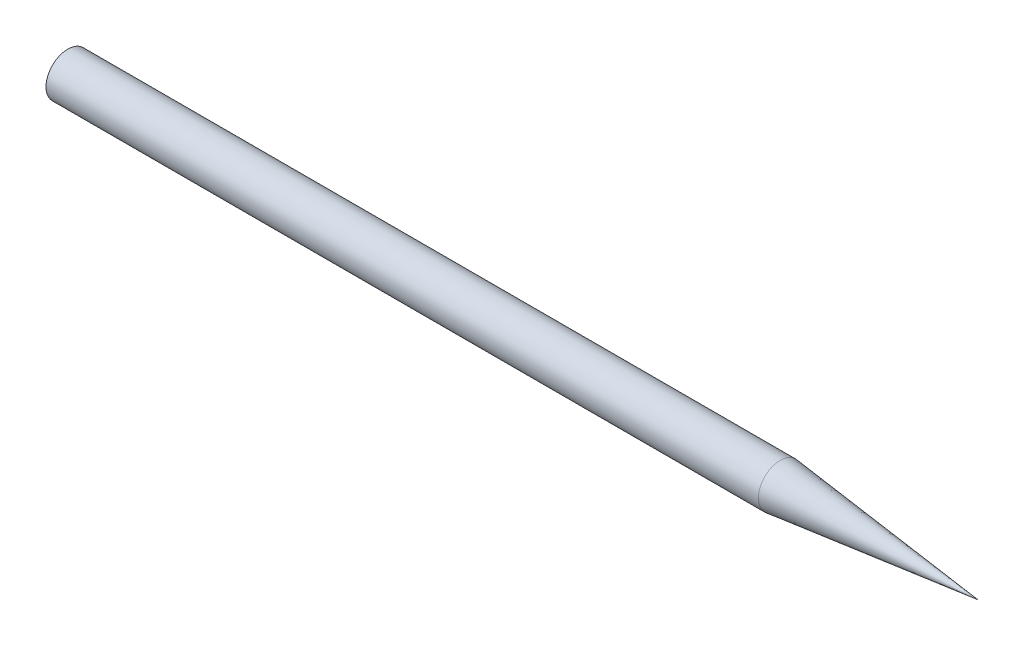
ISO-10303-21;
HEADER;
FILE_DESCRIPTION(('STEP AP214'),'2;1');
FILE_NAME('part.step','',(''),(''),'','','');
FILE_SCHEMA(('AUTOMOTIVE_DESIGN { 1 0 10303 214 1 1 1 1 }'));
ENDSEC;
DATA;
#1=APPLICATION_CONTEXT('core data for automotive mechanical design processes');
#2=APPLICATION_PROTOCOL_DEFINITION('international standard','automotive_design',2000,#1);
#3=PRODUCT_CONTEXT('',#1,'mechanical');
#4=PRODUCT('Part','Part','',(#3));
#5=PRODUCT_RELATED_PRODUCT_CATEGORY('part','',(#4));
#6=PRODUCT_DEFINITION_FORMATION('','',#4);
#7=PRODUCT_DEFINITION_CONTEXT('part definition',#1,'design');
#8=PRODUCT_DEFINITION('design','',#6,#7);
#9=PRODUCT_DEFINITION_SHAPE('','',#8);
#10=(LENGTH_UNIT() NAMED_UNIT(*) SI_UNIT(.MILLI.,.METRE.));
#11=(NAMED_UNIT(*) PLANE_ANGLE_UNIT() SI_UNIT($,.RADIAN.));
#12=(NAMED_UNIT(*) SI_UNIT($,.STERADIAN.) SOLID_ANGLE_UNIT());
#13=UNCERTAINTY_MEASURE_WITH_UNIT(LENGTH_MEASURE(1.E-05),#10,'distance_accuracy_value','');
#14=(GEOMETRIC_REPRESENTATION_CONTEXT(3) GLOBAL_UNCERTAINTY_ASSIGNED_CONTEXT((#13)) GLOBAL_UNIT_ASSIGNED_CONTEXT((#10,
#11,#12)) REPRESENTATION_CONTEXT('',''));
#15=CARTESIAN_POINT('',(0.,0.,0.));
#16=DIRECTION('',(0.,0.,1.));
#17=DIRECTION('',(1.,0.,0.));
#18=AXIS2_PLACEMENT_3D('',#15,#16,#17);
#19=CARTESIAN_POINT('',(23.,0.,0.));
#20=DIRECTION('',(-1.,0.,0.));
#21=DIRECTION('',(0.,0.,1.));
#22=AXIS2_PLACEMENT_3D('',#19,#20,#21);
#23=CONICAL_SURFACE('',#22,0.,0.109559526773944);
#24=CARTESIAN_POINT('',(18.,0.,0.));
#25=DIRECTION('',(-1.,0.,0.));
#26=DIRECTION('',(0.,0.,1.));
#27=AXIS2_PLACEMENT_3D('',#24,#25,#26);
#28=CIRCLE('',#27,0.55);
#29=CARTESIAN_POINT('',(18.,0.,0.55));
#30=VERTEX_POINT('',#29);
#31=EDGE_CURVE('E11',#30,#30,#28,.T.);
#32=ORIENTED_EDGE('',*,*,#31,.F.);
#33=EDGE_LOOP('',(#32));
#34=FACE_BOUND('',#33,.T.);
#35=CARTESIAN_POINT('',(23.,0.,0.));
#36=VERTEX_POINT('',#35);
#37=VERTEX_LOOP('',#36);
#38=FACE_BOUND('',#37,.T.);
#39=ADVANCED_FACE('F41',(#34,#38),#23,.T.);
#40=CARTESIAN_POINT('',(0.,0.,0.));
#41=DIRECTION('',(-1.,0.,0.));
#42=DIRECTION('',(0.,0.,1.));
#43=AXIS2_PLACEMENT_3D('',#40,#41,#42);
#44=CYLINDRICAL_SURFACE('',#43,0.55);
#45=ORIENTED_EDGE('',*,*,#31,.T.);
#46=EDGE_LOOP('',(#45));
#47=FACE_BOUND('',#46,.T.);
#48=CARTESIAN_POINT('',(0.,0.,0.));
#49=DIRECTION('',(-1.,0.,0.));
#50=DIRECTION('',(0.,0.,1.));
#51=AXIS2_PLACEMENT_3D('',#48,#49,#50);
#52=CIRCLE('',#51,0.55);
#53=CARTESIAN_POINT('',(0.,0.,0.55));
#54=VERTEX_POINT('',#53);
#55=EDGE_CURVE('E48',#54,#54,#52,.T.);
#56=ORIENTED_EDGE('',*,*,#55,.F.);
#57=EDGE_LOOP('',(#56));
#58=FACE_BOUND('',#57,.T.);
#59=ADVANCED_FACE('F52',(#47,#58),#44,.T.);
#60=CARTESIAN_POINT('',(0.,0.,0.));
#61=DIRECTION('',(-1.,0.,0.));
#62=DIRECTION('',(0.,0.,1.));
#63=AXIS2_PLACEMENT_3D('',#60,#61,#62);
#64=PLANE('',#63);
#65=ORIENTED_EDGE('',*,*,#55,.T.);
#66=EDGE_LOOP('',(#65));
#67=FACE_BOUND('',#66,.T.);
#68=ADVANCED_FACE('F57',(#67),#64,.T.);
#69=CLOSED_SHELL('',(#39,#59,#68));
#70=MANIFOLD_SOLID_BREP('B2',#69);
#71=ADVANCED_BREP_SHAPE_REPRESENTATION('',(#18,#70),#14);
#72=SHAPE_DEFINITION_REPRESENTATION(#9,#71);
ENDSEC;
END-ISO-10303-21;
